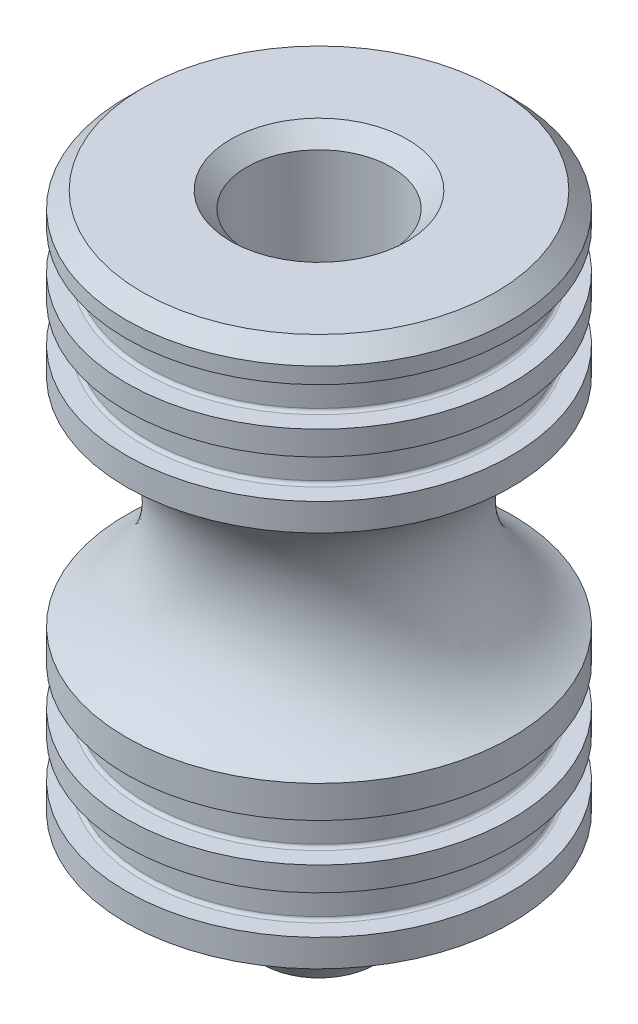
ISO-10303-21;
HEADER;
FILE_DESCRIPTION(('STEP AP214'),'2;1');
FILE_NAME('part.step','',(''),(''),'','','');
FILE_SCHEMA(('AUTOMOTIVE_DESIGN { 1 0 10303 214 1 1 1 1 }'));
ENDSEC;
DATA;
#1=APPLICATION_CONTEXT('core data for automotive mechanical design processes');
#2=APPLICATION_PROTOCOL_DEFINITION('international standard','automotive_design',2000,#1);
#3=PRODUCT_CONTEXT('',#1,'mechanical');
#4=PRODUCT('Part','Part','',(#3));
#5=PRODUCT_RELATED_PRODUCT_CATEGORY('part','',(#4));
#6=PRODUCT_DEFINITION_FORMATION('','',#4);
#7=PRODUCT_DEFINITION_CONTEXT('part definition',#1,'design');
#8=PRODUCT_DEFINITION('design','',#6,#7);
#9=PRODUCT_DEFINITION_SHAPE('','',#8);
#10=(LENGTH_UNIT() NAMED_UNIT(*) SI_UNIT(.MILLI.,.METRE.));
#11=(NAMED_UNIT(*) PLANE_ANGLE_UNIT() SI_UNIT($,.RADIAN.));
#12=(NAMED_UNIT(*) SI_UNIT($,.STERADIAN.) SOLID_ANGLE_UNIT());
#13=UNCERTAINTY_MEASURE_WITH_UNIT(LENGTH_MEASURE(1.E-05),#10,'distance_accuracy_value','');
#14=(GEOMETRIC_REPRESENTATION_CONTEXT(3) GLOBAL_UNCERTAINTY_ASSIGNED_CONTEXT((#13)) GLOBAL_UNIT_ASSIGNED_CONTEXT((#10,
#11,#12)) REPRESENTATION_CONTEXT('',''));
#15=CARTESIAN_POINT('',(0.,0.,0.));
#16=DIRECTION('',(0.,0.,1.));
#17=DIRECTION('',(1.,0.,0.));
#18=AXIS2_PLACEMENT_3D('',#15,#16,#17);
#19=CARTESIAN_POINT('',(0.,0.,0.));
#20=DIRECTION('',(0.,-1.,0.));
#21=DIRECTION('',(0.,0.,-1.));
#22=AXIS2_PLACEMENT_3D('',#19,#20,#21);
#23=PLANE('',#22);
#24=CARTESIAN_POINT('',(0.,0.,0.));
#25=DIRECTION('',(0.,-1.,0.));
#26=DIRECTION('',(0.,0.,-1.));
#27=AXIS2_PLACEMENT_3D('',#24,#25,#26);
#28=CIRCLE('',#27,3.5);
#29=CARTESIAN_POINT('',(0.,0.,-3.5));
#30=VERTEX_POINT('',#29);
#31=EDGE_CURVE('E188',#30,#30,#28,.T.);
#32=ORIENTED_EDGE('',*,*,#31,.T.);
#33=EDGE_LOOP('',(#32));
#34=FACE_BOUND('',#33,.T.);
#35=DIRECTION('',(-0.866025403784439,0.,-0.5));
#36=VECTOR('',#35,1.);
#37=CARTESIAN_POINT('',(1.,0.,-1.73205080756888));
#38=LINE('',#37,#36);
#39=CARTESIAN_POINT('',(2.,0.,-1.15470053837925));
#40=VERTEX_POINT('',#39);
#41=CARTESIAN_POINT('',(0.,0.,-2.3094010767585));
#42=VERTEX_POINT('',#41);
#43=EDGE_CURVE('E130',#40,#42,#38,.T.);
#44=ORIENTED_EDGE('',*,*,#43,.T.);
#45=DIRECTION('',(-0.866025403784439,0.,0.5));
#46=VECTOR('',#45,1.);
#47=CARTESIAN_POINT('',(-1.,0.,-1.73205080756888));
#48=LINE('',#47,#46);
#49=CARTESIAN_POINT('',(-2.,0.,-1.15470053837925));
#50=VERTEX_POINT('',#49);
#51=EDGE_CURVE('E58',#42,#50,#48,.T.);
#52=ORIENTED_EDGE('',*,*,#51,.T.);
#53=DIRECTION('',(0.,0.,1.));
#54=VECTOR('',#53,1.);
#55=CARTESIAN_POINT('',(-2.,0.,0.));
#56=LINE('',#55,#54);
#57=CARTESIAN_POINT('',(-2.,0.,1.15470053837925));
#58=VERTEX_POINT('',#57);
#59=EDGE_CURVE('E117',#50,#58,#56,.T.);
#60=ORIENTED_EDGE('',*,*,#59,.T.);
#61=DIRECTION('',(0.866025403784439,0.,0.5));
#62=VECTOR('',#61,1.);
#63=CARTESIAN_POINT('',(-1.,0.,1.73205080756888));
#64=LINE('',#63,#62);
#65=CARTESIAN_POINT('',(0.,0.,2.3094010767585));
#66=VERTEX_POINT('',#65);
#67=EDGE_CURVE('E120',#58,#66,#64,.T.);
#68=ORIENTED_EDGE('',*,*,#67,.T.);
#69=DIRECTION('',(0.866025403784439,0.,-0.5));
#70=VECTOR('',#69,1.);
#71=CARTESIAN_POINT('',(1.,0.,1.73205080756888));
#72=LINE('',#71,#70);
#73=CARTESIAN_POINT('',(2.,0.,1.15470053837925));
#74=VERTEX_POINT('',#73);
#75=EDGE_CURVE('E135',#66,#74,#72,.T.);
#76=ORIENTED_EDGE('',*,*,#75,.T.);
#77=DIRECTION('',(0.,0.,-1.));
#78=VECTOR('',#77,1.);
#79=CARTESIAN_POINT('',(2.,0.,0.));
#80=LINE('',#79,#78);
#81=EDGE_CURVE('E132',#74,#40,#80,.T.);
#82=ORIENTED_EDGE('',*,*,#81,.T.);
#83=EDGE_LOOP('',(#44,#52,#60,#68,#76,#82));
#84=FACE_BOUND('',#83,.T.);
#85=ADVANCED_FACE('F43',(#34,#84),#23,.T.);
#86=CARTESIAN_POINT('',(0.,0.,0.));
#87=DIRECTION('',(0.,-1.,0.));
#88=DIRECTION('',(0.,0.,-1.));
#89=AXIS2_PLACEMENT_3D('',#86,#87,#88);
#90=CYLINDRICAL_SURFACE('',#89,12.);
#91=CARTESIAN_POINT('',(0.,6.5,0.));
#92=DIRECTION('',(0.,-1.,0.));
#93=DIRECTION('',(0.,0.,-1.));
#94=AXIS2_PLACEMENT_3D('',#91,#92,#93);
#95=CIRCLE('',#94,12.);
#96=CARTESIAN_POINT('',(0.,6.5,-12.));
#97=VERTEX_POINT('',#96);
#98=EDGE_CURVE('E191',#97,#97,#95,.T.);
#99=ORIENTED_EDGE('',*,*,#98,.F.);
#100=EDGE_LOOP('',(#99));
#101=FACE_BOUND('',#100,.T.);
#102=CARTESIAN_POINT('',(0.,8.2,0.));
#103=DIRECTION('',(0.,-1.,0.));
#104=DIRECTION('',(0.,0.,-1.));
#105=AXIS2_PLACEMENT_3D('',#102,#103,#104);
#106=CIRCLE('',#105,12.);
#107=CARTESIAN_POINT('',(0.,8.2,-12.));
#108=VERTEX_POINT('',#107);
#109=EDGE_CURVE('E155',#108,#108,#106,.T.);
#110=ORIENTED_EDGE('',*,*,#109,.T.);
#111=EDGE_LOOP('',(#110));
#112=FACE_BOUND('',#111,.T.);
#113=ADVANCED_FACE('F301',(#101,#112),#90,.T.);
#114=CARTESIAN_POINT('',(0.,-7.53168300883464,0.));
#115=DIRECTION('',(0.,-1.,0.));
#116=DIRECTION('',(0.,0.,-1.));
#117=AXIS2_PLACEMENT_3D('',#114,#115,#116);
#118=TOROIDAL_SURFACE('',#117,15.9948164185206,14.5892661322666);
#119=ORIENTED_EDGE('',*,*,#31,.F.);
#120=EDGE_LOOP('',(#119));
#121=FACE_BOUND('',#120,.T.);
#122=ORIENTED_EDGE('',*,*,#98,.T.);
#123=EDGE_LOOP('',(#122));
#124=FACE_BOUND('',#123,.T.);
#125=ADVANCED_FACE('F307',(#121,#124),#118,.F.);
#126=CARTESIAN_POINT('',(0.,18.,0.));
#127=DIRECTION('',(0.,1.,0.));
#128=DIRECTION('',(0.,0.,1.));
#129=AXIS2_PLACEMENT_3D('',#126,#127,#128);
#130=PLANE('',#129);
#131=CARTESIAN_POINT('',(0.,18.,0.));
#132=DIRECTION('',(0.,1.,0.));
#133=DIRECTION('',(0.,0.,1.));
#134=AXIS2_PLACEMENT_3D('',#131,#132,#133);
#135=CIRCLE('',#134,3.5);
#136=CARTESIAN_POINT('',(0.,18.,3.5));
#137=VERTEX_POINT('',#136);
#138=EDGE_CURVE('E142',#137,#137,#135,.T.);
#139=ORIENTED_EDGE('',*,*,#138,.F.);
#140=EDGE_LOOP('',(#139));
#141=FACE_BOUND('',#140,.T.);
#142=CARTESIAN_POINT('',(0.,18.,0.));
#143=DIRECTION('',(0.,-1.,0.));
#144=DIRECTION('',(0.,0.,-1.));
#145=AXIS2_PLACEMENT_3D('',#142,#143,#144);
#146=CIRCLE('',#145,4.5);
#147=CARTESIAN_POINT('',(0.,18.,-4.5));
#148=VERTEX_POINT('',#147);
#149=EDGE_CURVE('E185',#148,#148,#146,.T.);
#150=ORIENTED_EDGE('',*,*,#149,.F.);
#151=EDGE_LOOP('',(#150));
#152=FACE_BOUND('',#151,.T.);
#153=ADVANCED_FACE('F315',(#141,#152),#130,.T.);
#154=CARTESIAN_POINT('',(0.,0.,0.));
#155=DIRECTION('',(0.,-1.,0.));
#156=DIRECTION('',(0.,0.,-1.));
#157=AXIS2_PLACEMENT_3D('',#154,#155,#156);
#158=CYLINDRICAL_SURFACE('',#157,4.5);
#159=CARTESIAN_POINT('',(0.,39.,0.));
#160=DIRECTION('',(0.,1.,0.));
#161=DIRECTION('',(0.,0.,1.));
#162=AXIS2_PLACEMENT_3D('',#159,#160,#161);
#163=CIRCLE('',#162,4.5);
#164=CARTESIAN_POINT('',(0.,39.,4.5));
#165=VERTEX_POINT('',#164);
#166=EDGE_CURVE('E203',#165,#165,#163,.T.);
#167=ORIENTED_EDGE('',*,*,#166,.T.);
#168=EDGE_LOOP('',(#167));
#169=FACE_BOUND('',#168,.T.);
#170=ORIENTED_EDGE('',*,*,#149,.T.);
#171=EDGE_LOOP('',(#170));
#172=FACE_BOUND('',#171,.T.);
#173=ADVANCED_FACE('F378',(#169,#172),#158,.F.);
#174=CARTESIAN_POINT('',(0.,40.,0.));
#175=DIRECTION('',(0.,1.,0.));
#176=DIRECTION('',(0.,0.,1.));
#177=AXIS2_PLACEMENT_3D('',#174,#175,#176);
#178=PLANE('',#177);
#179=CARTESIAN_POINT('',(0.,40.,0.));
#180=DIRECTION('',(0.,1.,0.));
#181=DIRECTION('',(0.,0.,1.));
#182=AXIS2_PLACEMENT_3D('',#179,#180,#181);
#183=CIRCLE('',#182,11.);
#184=CARTESIAN_POINT('',(0.,40.,11.));
#185=VERTEX_POINT('',#184);
#186=EDGE_CURVE('E200',#185,#185,#183,.T.);
#187=ORIENTED_EDGE('',*,*,#186,.T.);
#188=EDGE_LOOP('',(#187));
#189=FACE_BOUND('',#188,.T.);
#190=CARTESIAN_POINT('',(0.,40.,0.));
#191=DIRECTION('',(0.,1.,0.));
#192=DIRECTION('',(0.,0.,1.));
#193=AXIS2_PLACEMENT_3D('',#190,#191,#192);
#194=CIRCLE('',#193,5.50000000000001);
#195=CARTESIAN_POINT('',(0.,40.,5.50000000000001));
#196=VERTEX_POINT('',#195);
#197=EDGE_CURVE('E197',#196,#196,#194,.F.);
#198=ORIENTED_EDGE('',*,*,#197,.T.);
#199=EDGE_LOOP('',(#198));
#200=FACE_BOUND('',#199,.T.);
#201=ADVANCED_FACE('F298',(#189,#200),#178,.T.);
#202=CARTESIAN_POINT('',(0.,0.,0.));
#203=DIRECTION('',(0.,-1.,0.));
#204=DIRECTION('',(0.,0.,-1.));
#205=AXIS2_PLACEMENT_3D('',#202,#203,#204);
#206=CYLINDRICAL_SURFACE('',#205,12.);
#207=CARTESIAN_POINT('',(0.,39.,0.));
#208=DIRECTION('',(0.,1.,0.));
#209=DIRECTION('',(0.,0.,1.));
#210=AXIS2_PLACEMENT_3D('',#207,#208,#209);
#211=CIRCLE('',#210,12.);
#212=CARTESIAN_POINT('',(0.,39.,12.));
#213=VERTEX_POINT('',#212);
#214=EDGE_CURVE('E194',#213,#213,#211,.F.);
#215=ORIENTED_EDGE('',*,*,#214,.T.);
#216=EDGE_LOOP('',(#215));
#217=FACE_BOUND('',#216,.T.);
#218=CARTESIAN_POINT('',(0.,38.,0.));
#219=DIRECTION('',(0.,-1.,0.));
#220=DIRECTION('',(0.,0.,-1.));
#221=AXIS2_PLACEMENT_3D('',#218,#219,#220);
#222=CIRCLE('',#221,12.);
#223=CARTESIAN_POINT('',(0.,38.,-12.));
#224=VERTEX_POINT('',#223);
#225=EDGE_CURVE('E182',#224,#224,#222,.T.);
#226=ORIENTED_EDGE('',*,*,#225,.F.);
#227=EDGE_LOOP('',(#226));
#228=FACE_BOUND('',#227,.T.);
#229=ADVANCED_FACE('F281',(#217,#228),#206,.T.);
#230=CARTESIAN_POINT('',(0.,38.,0.));
#231=DIRECTION('',(0.,1.,0.));
#232=DIRECTION('',(0.,0.,1.));
#233=AXIS2_PLACEMENT_3D('',#230,#231,#232);
#234=PLANE('',#233);
#235=CARTESIAN_POINT('',(0.,38.,0.));
#236=DIRECTION('',(0.,1.,0.));
#237=DIRECTION('',(0.,0.,1.));
#238=AXIS2_PLACEMENT_3D('',#235,#236,#237);
#239=CIRCLE('',#238,10.9);
#240=CARTESIAN_POINT('',(0.,38.,10.9));
#241=VERTEX_POINT('',#240);
#242=EDGE_CURVE('E51',#241,#241,#239,.T.);
#243=ORIENTED_EDGE('',*,*,#242,.T.);
#244=EDGE_LOOP('',(#243));
#245=FACE_BOUND('',#244,.T.);
#246=ORIENTED_EDGE('',*,*,#225,.T.);
#247=EDGE_LOOP('',(#246));
#248=FACE_BOUND('',#247,.T.);
#249=ADVANCED_FACE('F250',(#245,#248),#234,.F.);
#250=CARTESIAN_POINT('',(0.,0.,0.));
#251=DIRECTION('',(0.,-1.,0.));
#252=DIRECTION('',(0.,0.,-1.));
#253=AXIS2_PLACEMENT_3D('',#250,#251,#252);
#254=CYLINDRICAL_SURFACE('',#253,10.7);
#255=CARTESIAN_POINT('',(0.,37.8,0.));
#256=DIRECTION('',(0.,1.,0.));
#257=DIRECTION('',(0.,0.,1.));
#258=AXIS2_PLACEMENT_3D('',#255,#256,#257);
#259=CIRCLE('',#258,10.7);
#260=CARTESIAN_POINT('',(0.,37.8,10.7));
#261=VERTEX_POINT('',#260);
#262=EDGE_CURVE('E245',#261,#261,#259,.F.);
#263=ORIENTED_EDGE('',*,*,#262,.T.);
#264=EDGE_LOOP('',(#263));
#265=FACE_BOUND('',#264,.T.);
#266=CARTESIAN_POINT('',(0.,35.8,0.));
#267=DIRECTION('',(0.,-1.,0.));
#268=DIRECTION('',(0.,0.,-1.));
#269=AXIS2_PLACEMENT_3D('',#266,#267,#268);
#270=CIRCLE('',#269,10.7);
#271=CARTESIAN_POINT('',(0.,35.8,-10.7));
#272=VERTEX_POINT('',#271);
#273=EDGE_CURVE('E242',#272,#272,#270,.F.);
#274=ORIENTED_EDGE('',*,*,#273,.T.);
#275=EDGE_LOOP('',(#274));
#276=FACE_BOUND('',#275,.T.);
#277=ADVANCED_FACE('F259',(#265,#276),#254,.T.);
#278=CARTESIAN_POINT('',(0.,35.6,0.));
#279=DIRECTION('',(0.,-1.,0.));
#280=DIRECTION('',(0.,0.,-1.));
#281=AXIS2_PLACEMENT_3D('',#278,#279,#280);
#282=PLANE('',#281);
#283=CARTESIAN_POINT('',(0.,35.6,0.));
#284=DIRECTION('',(0.,-1.,0.));
#285=DIRECTION('',(0.,0.,-1.));
#286=AXIS2_PLACEMENT_3D('',#283,#284,#285);
#287=CIRCLE('',#286,10.9);
#288=CARTESIAN_POINT('',(0.,35.6,-10.9));
#289=VERTEX_POINT('',#288);
#290=EDGE_CURVE('E11',#289,#289,#287,.T.);
#291=ORIENTED_EDGE('',*,*,#290,.T.);
#292=EDGE_LOOP('',(#291));
#293=FACE_BOUND('',#292,.T.);
#294=CARTESIAN_POINT('',(0.,35.6,0.));
#295=DIRECTION('',(0.,-1.,0.));
#296=DIRECTION('',(0.,0.,-1.));
#297=AXIS2_PLACEMENT_3D('',#294,#295,#296);
#298=CIRCLE('',#297,12.);
#299=CARTESIAN_POINT('',(0.,35.6,-12.));
#300=VERTEX_POINT('',#299);
#301=EDGE_CURVE('E179',#300,#300,#298,.T.);
#302=ORIENTED_EDGE('',*,*,#301,.F.);
#303=EDGE_LOOP('',(#302));
#304=FACE_BOUND('',#303,.T.);
#305=ADVANCED_FACE('F262',(#293,#304),#282,.F.);
#306=CARTESIAN_POINT('',(0.,34.1,0.));
#307=DIRECTION('',(0.,-1.,0.));
#308=DIRECTION('',(0.,0.,-1.));
#309=AXIS2_PLACEMENT_3D('',#306,#307,#308);
#310=CIRCLE('',#309,12.);
#311=CARTESIAN_POINT('',(0.,34.1,-12.));
#312=VERTEX_POINT('',#311);
#313=EDGE_CURVE('E176',#312,#312,#310,.T.);
#314=ORIENTED_EDGE('',*,*,#313,.F.);
#315=EDGE_LOOP('',(#314));
#316=FACE_BOUND('',#315,.T.);
#317=ORIENTED_EDGE('',*,*,#301,.T.);
#318=EDGE_LOOP('',(#317));
#319=FACE_BOUND('',#318,.T.);
#320=ADVANCED_FACE('F272',(#316,#319),#206,.T.);
#321=CARTESIAN_POINT('',(0.,34.1,0.));
#322=DIRECTION('',(0.,1.,0.));
#323=DIRECTION('',(0.,0.,1.));
#324=AXIS2_PLACEMENT_3D('',#321,#322,#323);
#325=PLANE('',#324);
#326=CARTESIAN_POINT('',(0.,34.1,0.));
#327=DIRECTION('',(0.,1.,0.));
#328=DIRECTION('',(0.,0.,1.));
#329=AXIS2_PLACEMENT_3D('',#326,#327,#328);
#330=CIRCLE('',#329,10.9);
#331=CARTESIAN_POINT('',(0.,34.1,10.9));
#332=VERTEX_POINT('',#331);
#333=EDGE_CURVE('E236',#332,#332,#330,.T.);
#334=ORIENTED_EDGE('',*,*,#333,.T.);
#335=EDGE_LOOP('',(#334));
#336=FACE_BOUND('',#335,.T.);
#337=ORIENTED_EDGE('',*,*,#313,.T.);
#338=EDGE_LOOP('',(#337));
#339=FACE_BOUND('',#338,.T.);
#340=ADVANCED_FACE('F277',(#336,#339),#325,.F.);
#341=CARTESIAN_POINT('',(0.,0.,0.));
#342=DIRECTION('',(0.,-1.,0.));
#343=DIRECTION('',(0.,0.,-1.));
#344=AXIS2_PLACEMENT_3D('',#341,#342,#343);
#345=CYLINDRICAL_SURFACE('',#344,10.7);
#346=CARTESIAN_POINT('',(0.,33.9,0.));
#347=DIRECTION('',(0.,1.,0.));
#348=DIRECTION('',(0.,0.,1.));
#349=AXIS2_PLACEMENT_3D('',#346,#347,#348);
#350=CIRCLE('',#349,10.7);
#351=CARTESIAN_POINT('',(0.,33.9,10.7));
#352=VERTEX_POINT('',#351);
#353=EDGE_CURVE('E233',#352,#352,#350,.F.);
#354=ORIENTED_EDGE('',*,*,#353,.T.);
#355=EDGE_LOOP('',(#354));
#356=FACE_BOUND('',#355,.T.);
#357=CARTESIAN_POINT('',(0.,31.9,0.));
#358=DIRECTION('',(0.,-1.,0.));
#359=DIRECTION('',(0.,0.,-1.));
#360=AXIS2_PLACEMENT_3D('',#357,#358,#359);
#361=CIRCLE('',#360,10.7);
#362=CARTESIAN_POINT('',(0.,31.9,-10.7));
#363=VERTEX_POINT('',#362);
#364=EDGE_CURVE('E230',#363,#363,#361,.F.);
#365=ORIENTED_EDGE('',*,*,#364,.T.);
#366=EDGE_LOOP('',(#365));
#367=FACE_BOUND('',#366,.T.);
#368=ADVANCED_FACE('F287',(#356,#367),#345,.T.);
#369=CARTESIAN_POINT('',(0.,31.7,0.));
#370=DIRECTION('',(0.,-1.,0.));
#371=DIRECTION('',(0.,0.,-1.));
#372=AXIS2_PLACEMENT_3D('',#369,#370,#371);
#373=PLANE('',#372);
#374=CARTESIAN_POINT('',(0.,31.7,0.));
#375=DIRECTION('',(0.,-1.,0.));
#376=DIRECTION('',(0.,0.,-1.));
#377=AXIS2_PLACEMENT_3D('',#374,#375,#376);
#378=CIRCLE('',#377,10.9);
#379=CARTESIAN_POINT('',(0.,31.7,-10.9));
#380=VERTEX_POINT('',#379);
#381=EDGE_CURVE('E239',#380,#380,#378,.T.);
#382=ORIENTED_EDGE('',*,*,#381,.T.);
#383=EDGE_LOOP('',(#382));
#384=FACE_BOUND('',#383,.T.);
#385=CARTESIAN_POINT('',(0.,31.7,0.));
#386=DIRECTION('',(0.,-1.,0.));
#387=DIRECTION('',(0.,0.,-1.));
#388=AXIS2_PLACEMENT_3D('',#385,#386,#387);
#389=CIRCLE('',#388,12.);
#390=CARTESIAN_POINT('',(0.,31.7,-12.));
#391=VERTEX_POINT('',#390);
#392=EDGE_CURVE('E173',#391,#391,#389,.T.);
#393=ORIENTED_EDGE('',*,*,#392,.F.);
#394=EDGE_LOOP('',(#393));
#395=FACE_BOUND('',#394,.T.);
#396=ADVANCED_FACE('F295',(#384,#395),#373,.F.);
#397=CARTESIAN_POINT('',(0.,30.,0.));
#398=DIRECTION('',(0.,-1.,0.));
#399=DIRECTION('',(0.,0.,-1.));
#400=AXIS2_PLACEMENT_3D('',#397,#398,#399);
#401=CIRCLE('',#400,12.);
#402=CARTESIAN_POINT('',(0.,30.,-12.));
#403=VERTEX_POINT('',#402);
#404=EDGE_CURVE('E170',#403,#403,#401,.T.);
#405=ORIENTED_EDGE('',*,*,#404,.F.);
#406=EDGE_LOOP('',(#405));
#407=FACE_BOUND('',#406,.T.);
#408=ORIENTED_EDGE('',*,*,#392,.T.);
#409=EDGE_LOOP('',(#408));
#410=FACE_BOUND('',#409,.T.);
#411=ADVANCED_FACE('F280',(#407,#410),#206,.T.);
#412=CARTESIAN_POINT('',(0.,23.25,0.));
#413=DIRECTION('',(0.,-1.,0.));
#414=DIRECTION('',(0.,0.,-1.));
#415=AXIS2_PLACEMENT_3D('',#412,#413,#414);
#416=TOROIDAL_SURFACE('',#415,15.2691742076555,7.5);
#417=ORIENTED_EDGE('',*,*,#404,.T.);
#418=EDGE_LOOP('',(#417));
#419=FACE_BOUND('',#418,.T.);
#420=CARTESIAN_POINT('',(0.,16.5,0.));
#421=DIRECTION('',(0.,-1.,0.));
#422=DIRECTION('',(0.,0.,-1.));
#423=AXIS2_PLACEMENT_3D('',#420,#421,#422);
#424=CIRCLE('',#423,12.);
#425=CARTESIAN_POINT('',(0.,16.5,-12.));
#426=VERTEX_POINT('',#425);
#427=EDGE_CURVE('E167',#426,#426,#424,.T.);
#428=ORIENTED_EDGE('',*,*,#427,.F.);
#429=EDGE_LOOP('',(#428));
#430=FACE_BOUND('',#429,.T.);
#431=ADVANCED_FACE('F294',(#419,#430),#416,.F.);
#432=CARTESIAN_POINT('',(0.,14.5,0.));
#433=DIRECTION('',(0.,-1.,0.));
#434=DIRECTION('',(0.,0.,-1.));
#435=AXIS2_PLACEMENT_3D('',#432,#433,#434);
#436=CIRCLE('',#435,12.);
#437=CARTESIAN_POINT('',(0.,14.5,-12.));
#438=VERTEX_POINT('',#437);
#439=EDGE_CURVE('E164',#438,#438,#436,.T.);
#440=ORIENTED_EDGE('',*,*,#439,.F.);
#441=EDGE_LOOP('',(#440));
#442=FACE_BOUND('',#441,.T.);
#443=ORIENTED_EDGE('',*,*,#427,.T.);
#444=EDGE_LOOP('',(#443));
#445=FACE_BOUND('',#444,.T.);
#446=ADVANCED_FACE('F310',(#442,#445),#90,.T.);
#447=CARTESIAN_POINT('',(0.,14.5,0.));
#448=DIRECTION('',(0.,1.,0.));
#449=DIRECTION('',(0.,0.,1.));
#450=AXIS2_PLACEMENT_3D('',#447,#448,#449);
#451=PLANE('',#450);
#452=CARTESIAN_POINT('',(0.,14.5,0.));
#453=DIRECTION('',(0.,1.,0.));
#454=DIRECTION('',(0.,0.,1.));
#455=AXIS2_PLACEMENT_3D('',#452,#453,#454);
#456=CIRCLE('',#455,10.9);
#457=CARTESIAN_POINT('',(0.,14.5,10.9));
#458=VERTEX_POINT('',#457);
#459=EDGE_CURVE('E212',#458,#458,#456,.T.);
#460=ORIENTED_EDGE('',*,*,#459,.T.);
#461=EDGE_LOOP('',(#460));
#462=FACE_BOUND('',#461,.T.);
#463=ORIENTED_EDGE('',*,*,#439,.T.);
#464=EDGE_LOOP('',(#463));
#465=FACE_BOUND('',#464,.T.);
#466=ADVANCED_FACE('F431',(#462,#465),#451,.F.);
#467=CARTESIAN_POINT('',(0.,0.,0.));
#468=DIRECTION('',(0.,-1.,0.));
#469=DIRECTION('',(0.,0.,-1.));
#470=AXIS2_PLACEMENT_3D('',#467,#468,#469);
#471=CYLINDRICAL_SURFACE('',#470,10.7);
#472=CARTESIAN_POINT('',(0.,14.3,0.));
#473=DIRECTION('',(0.,1.,0.));
#474=DIRECTION('',(0.,0.,1.));
#475=AXIS2_PLACEMENT_3D('',#472,#473,#474);
#476=CIRCLE('',#475,10.7);
#477=CARTESIAN_POINT('',(0.,14.3,10.7));
#478=VERTEX_POINT('',#477);
#479=EDGE_CURVE('E209',#478,#478,#476,.F.);
#480=ORIENTED_EDGE('',*,*,#479,.T.);
#481=EDGE_LOOP('',(#480));
#482=FACE_BOUND('',#481,.T.);
#483=CARTESIAN_POINT('',(0.,12.3,0.));
#484=DIRECTION('',(0.,-1.,0.));
#485=DIRECTION('',(0.,0.,-1.));
#486=AXIS2_PLACEMENT_3D('',#483,#484,#485);
#487=CIRCLE('',#486,10.7);
#488=CARTESIAN_POINT('',(0.,12.3,-10.7));
#489=VERTEX_POINT('',#488);
#490=EDGE_CURVE('E206',#489,#489,#487,.F.);
#491=ORIENTED_EDGE('',*,*,#490,.T.);
#492=EDGE_LOOP('',(#491));
#493=FACE_BOUND('',#492,.T.);
#494=ADVANCED_FACE('F427',(#482,#493),#471,.T.);
#495=CARTESIAN_POINT('',(0.,12.1,0.));
#496=DIRECTION('',(0.,-1.,0.));
#497=DIRECTION('',(0.,0.,-1.));
#498=AXIS2_PLACEMENT_3D('',#495,#496,#497);
#499=PLANE('',#498);
#500=CARTESIAN_POINT('',(0.,12.1,0.));
#501=DIRECTION('',(0.,-1.,0.));
#502=DIRECTION('',(0.,0.,-1.));
#503=AXIS2_PLACEMENT_3D('',#500,#501,#502);
#504=CIRCLE('',#503,10.9);
#505=CARTESIAN_POINT('',(0.,12.1,-10.9));
#506=VERTEX_POINT('',#505);
#507=EDGE_CURVE('E215',#506,#506,#504,.T.);
#508=ORIENTED_EDGE('',*,*,#507,.T.);
#509=EDGE_LOOP('',(#508));
#510=FACE_BOUND('',#509,.T.);
#511=CARTESIAN_POINT('',(0.,12.1,0.));
#512=DIRECTION('',(0.,-1.,0.));
#513=DIRECTION('',(0.,0.,-1.));
#514=AXIS2_PLACEMENT_3D('',#511,#512,#513);
#515=CIRCLE('',#514,12.);
#516=CARTESIAN_POINT('',(0.,12.1,-12.));
#517=VERTEX_POINT('',#516);
#518=EDGE_CURVE('E161',#517,#517,#515,.T.);
#519=ORIENTED_EDGE('',*,*,#518,.F.);
#520=EDGE_LOOP('',(#519));
#521=FACE_BOUND('',#520,.T.);
#522=ADVANCED_FACE('F423',(#510,#521),#499,.F.);
#523=CARTESIAN_POINT('',(0.,10.6,0.));
#524=DIRECTION('',(0.,-1.,0.));
#525=DIRECTION('',(0.,0.,-1.));
#526=AXIS2_PLACEMENT_3D('',#523,#524,#525);
#527=CIRCLE('',#526,12.);
#528=CARTESIAN_POINT('',(0.,10.6,-12.));
#529=VERTEX_POINT('',#528);
#530=EDGE_CURVE('E158',#529,#529,#527,.T.);
#531=ORIENTED_EDGE('',*,*,#530,.F.);
#532=EDGE_LOOP('',(#531));
#533=FACE_BOUND('',#532,.T.);
#534=ORIENTED_EDGE('',*,*,#518,.T.);
#535=EDGE_LOOP('',(#534));
#536=FACE_BOUND('',#535,.T.);
#537=ADVANCED_FACE('F311',(#533,#536),#90,.T.);
#538=CARTESIAN_POINT('',(0.,10.6,0.));
#539=DIRECTION('',(0.,1.,0.));
#540=DIRECTION('',(0.,0.,1.));
#541=AXIS2_PLACEMENT_3D('',#538,#539,#540);
#542=PLANE('',#541);
#543=CARTESIAN_POINT('',(0.,10.6,0.));
#544=DIRECTION('',(0.,1.,0.));
#545=DIRECTION('',(0.,0.,1.));
#546=AXIS2_PLACEMENT_3D('',#543,#544,#545);
#547=CIRCLE('',#546,10.9);
#548=CARTESIAN_POINT('',(0.,10.6,10.9));
#549=VERTEX_POINT('',#548);
#550=EDGE_CURVE('E224',#549,#549,#547,.T.);
#551=ORIENTED_EDGE('',*,*,#550,.T.);
#552=EDGE_LOOP('',(#551));
#553=FACE_BOUND('',#552,.T.);
#554=ORIENTED_EDGE('',*,*,#530,.T.);
#555=EDGE_LOOP('',(#554));
#556=FACE_BOUND('',#555,.T.);
#557=ADVANCED_FACE('F417',(#553,#556),#542,.F.);
#558=CARTESIAN_POINT('',(0.,0.,0.));
#559=DIRECTION('',(0.,-1.,0.));
#560=DIRECTION('',(0.,0.,-1.));
#561=AXIS2_PLACEMENT_3D('',#558,#559,#560);
#562=CYLINDRICAL_SURFACE('',#561,10.7);
#563=CARTESIAN_POINT('',(0.,10.4,0.));
#564=DIRECTION('',(0.,1.,0.));
#565=DIRECTION('',(0.,0.,1.));
#566=AXIS2_PLACEMENT_3D('',#563,#564,#565);
#567=CIRCLE('',#566,10.7);
#568=CARTESIAN_POINT('',(0.,10.4,10.7));
#569=VERTEX_POINT('',#568);
#570=EDGE_CURVE('E221',#569,#569,#567,.F.);
#571=ORIENTED_EDGE('',*,*,#570,.T.);
#572=EDGE_LOOP('',(#571));
#573=FACE_BOUND('',#572,.T.);
#574=CARTESIAN_POINT('',(0.,8.4,0.));
#575=DIRECTION('',(0.,-1.,0.));
#576=DIRECTION('',(0.,0.,-1.));
#577=AXIS2_PLACEMENT_3D('',#574,#575,#576);
#578=CIRCLE('',#577,10.7);
#579=CARTESIAN_POINT('',(0.,8.4,-10.7));
#580=VERTEX_POINT('',#579);
#581=EDGE_CURVE('E218',#580,#580,#578,.F.);
#582=ORIENTED_EDGE('',*,*,#581,.T.);
#583=EDGE_LOOP('',(#582));
#584=FACE_BOUND('',#583,.T.);
#585=ADVANCED_FACE('F413',(#573,#584),#562,.T.);
#586=CARTESIAN_POINT('',(0.,8.2,0.));
#587=DIRECTION('',(0.,-1.,0.));
#588=DIRECTION('',(0.,0.,-1.));
#589=AXIS2_PLACEMENT_3D('',#586,#587,#588);
#590=PLANE('',#589);
#591=CARTESIAN_POINT('',(0.,8.2,0.));
#592=DIRECTION('',(0.,-1.,0.));
#593=DIRECTION('',(0.,0.,-1.));
#594=AXIS2_PLACEMENT_3D('',#591,#592,#593);
#595=CIRCLE('',#594,10.9);
#596=CARTESIAN_POINT('',(0.,8.2,-10.9));
#597=VERTEX_POINT('',#596);
#598=EDGE_CURVE('E227',#597,#597,#595,.T.);
#599=ORIENTED_EDGE('',*,*,#598,.T.);
#600=EDGE_LOOP('',(#599));
#601=FACE_BOUND('',#600,.T.);
#602=ORIENTED_EDGE('',*,*,#109,.F.);
#603=EDGE_LOOP('',(#602));
#604=FACE_BOUND('',#603,.T.);
#605=ADVANCED_FACE('F328',(#601,#604),#590,.F.);
#606=CARTESIAN_POINT('',(0.,39.,0.));
#607=DIRECTION('',(0.,-1.,0.));
#608=DIRECTION('',(0.,0.,-1.));
#609=AXIS2_PLACEMENT_3D('',#606,#607,#608);
#610=CONICAL_SURFACE('',#609,12.,0.785398163397452);
#611=ORIENTED_EDGE('',*,*,#186,.F.);
#612=EDGE_LOOP('',(#611));
#613=FACE_BOUND('',#612,.T.);
#614=ORIENTED_EDGE('',*,*,#214,.F.);
#615=EDGE_LOOP('',(#614));
#616=FACE_BOUND('',#615,.T.);
#617=ADVANCED_FACE('F321',(#613,#616),#610,.T.);
#618=CARTESIAN_POINT('',(0.,40.,0.));
#619=DIRECTION('',(0.,1.,0.));
#620=DIRECTION('',(0.,0.,1.));
#621=AXIS2_PLACEMENT_3D('',#618,#619,#620);
#622=CONICAL_SURFACE('',#621,5.50000000000001,0.785398163397447);
#623=ORIENTED_EDGE('',*,*,#166,.F.);
#624=EDGE_LOOP('',(#623));
#625=FACE_BOUND('',#624,.T.);
#626=ORIENTED_EDGE('',*,*,#197,.F.);
#627=EDGE_LOOP('',(#626));
#628=FACE_BOUND('',#627,.T.);
#629=ADVANCED_FACE('F327',(#625,#628),#622,.F.);
#630=CARTESIAN_POINT('',(0.,11.1030121665965,0.));
#631=DIRECTION('',(0.,1.,0.));
#632=DIRECTION('',(0.,0.,1.));
#633=AXIS2_PLACEMENT_3D('',#630,#631,#632);
#634=CONICAL_SURFACE('',#633,3.5,1.02974425867665);
#635=CARTESIAN_POINT('',(0.,9.,0.));
#636=VERTEX_POINT('',#635);
#637=VERTEX_LOOP('',#636);
#638=FACE_BOUND('',#637,.T.);
#639=CARTESIAN_POINT('',(0.,11.1030121665965,0.));
#640=DIRECTION('',(0.,1.,0.));
#641=DIRECTION('',(0.,0.,1.));
#642=AXIS2_PLACEMENT_3D('',#639,#640,#641);
#643=CIRCLE('',#642,3.5);
#644=CARTESIAN_POINT('',(0.,11.1030121665965,3.5));
#645=VERTEX_POINT('',#644);
#646=EDGE_CURVE('E152',#645,#645,#643,.T.);
#647=ORIENTED_EDGE('',*,*,#646,.T.);
#648=EDGE_LOOP('',(#647));
#649=FACE_BOUND('',#648,.T.);
#650=ADVANCED_FACE('F334',(#638,#649),#634,.F.);
#651=CARTESIAN_POINT('',(0.,18.,0.));
#652=DIRECTION('',(0.,1.,0.));
#653=DIRECTION('',(0.,0.,1.));
#654=AXIS2_PLACEMENT_3D('',#651,#652,#653);
#655=CYLINDRICAL_SURFACE('',#654,3.5);
#656=ORIENTED_EDGE('',*,*,#646,.F.);
#657=EDGE_LOOP('',(#656));
#658=FACE_BOUND('',#657,.T.);
#659=ORIENTED_EDGE('',*,*,#138,.T.);
#660=EDGE_LOOP('',(#659));
#661=FACE_BOUND('',#660,.T.);
#662=ADVANCED_FACE('F397',(#658,#661),#655,.F.);
#663=CARTESIAN_POINT('',(-1.,3.,-1.73205080756888));
#664=DIRECTION('',(0.5,0.,0.866025403784439));
#665=DIRECTION('',(0.866025403784439,0.,-0.5));
#666=AXIS2_PLACEMENT_3D('',#663,#664,#665);
#667=PLANE('',#666);
#668=ORIENTED_EDGE('',*,*,#51,.F.);
#669=DIRECTION('',(0.,-1.,0.));
#670=VECTOR('',#669,1.);
#671=CARTESIAN_POINT('',(0.,3.,-2.3094010767585));
#672=LINE('',#671,#670);
#673=CARTESIAN_POINT('',(0.,3.,-2.3094010767585));
#674=VERTEX_POINT('',#673);
#675=EDGE_CURVE('E101',#674,#42,#672,.T.);
#676=ORIENTED_EDGE('',*,*,#675,.F.);
#677=DIRECTION('',(-0.866025403784439,0.,0.5));
#678=VECTOR('',#677,1.);
#679=CARTESIAN_POINT('',(-1.,3.,-1.73205080756888));
#680=LINE('',#679,#678);
#681=CARTESIAN_POINT('',(-2.,3.,-1.15470053837925));
#682=VERTEX_POINT('',#681);
#683=EDGE_CURVE('E108',#674,#682,#680,.T.);
#684=ORIENTED_EDGE('',*,*,#683,.T.);
#685=DIRECTION('',(0.,-1.,0.));
#686=VECTOR('',#685,1.);
#687=CARTESIAN_POINT('',(-2.,3.,-1.15470053837925));
#688=LINE('',#687,#686);
#689=EDGE_CURVE('E140',#682,#50,#688,.T.);
#690=ORIENTED_EDGE('',*,*,#689,.T.);
#691=EDGE_LOOP('',(#668,#676,#684,#690));
#692=FACE_BOUND('',#691,.T.);
#693=ADVANCED_FACE('F111',(#692),#667,.T.);
#694=CARTESIAN_POINT('',(-2.,3.,0.));
#695=DIRECTION('',(1.,0.,0.));
#696=DIRECTION('',(0.,0.,-1.));
#697=AXIS2_PLACEMENT_3D('',#694,#695,#696);
#698=PLANE('',#697);
#699=ORIENTED_EDGE('',*,*,#59,.F.);
#700=ORIENTED_EDGE('',*,*,#689,.F.);
#701=DIRECTION('',(0.,0.,1.));
#702=VECTOR('',#701,1.);
#703=CARTESIAN_POINT('',(-2.,3.,0.));
#704=LINE('',#703,#702);
#705=CARTESIAN_POINT('',(-2.,3.,1.15470053837925));
#706=VERTEX_POINT('',#705);
#707=EDGE_CURVE('E113',#682,#706,#704,.T.);
#708=ORIENTED_EDGE('',*,*,#707,.T.);
#709=DIRECTION('',(0.,-1.,0.));
#710=VECTOR('',#709,1.);
#711=CARTESIAN_POINT('',(-2.,3.,1.15470053837925));
#712=LINE('',#711,#710);
#713=EDGE_CURVE('E143',#706,#58,#712,.T.);
#714=ORIENTED_EDGE('',*,*,#713,.T.);
#715=EDGE_LOOP('',(#699,#700,#708,#714));
#716=FACE_BOUND('',#715,.T.);
#717=ADVANCED_FACE('F405',(#716),#698,.T.);
#718=CARTESIAN_POINT('',(-1.,3.,1.73205080756888));
#719=DIRECTION('',(0.5,0.,-0.866025403784439));
#720=DIRECTION('',(-0.866025403784439,0.,-0.5));
#721=AXIS2_PLACEMENT_3D('',#718,#719,#720);
#722=PLANE('',#721);
#723=ORIENTED_EDGE('',*,*,#67,.F.);
#724=ORIENTED_EDGE('',*,*,#713,.F.);
#725=DIRECTION('',(0.866025403784439,0.,0.5));
#726=VECTOR('',#725,1.);
#727=CARTESIAN_POINT('',(-1.,3.,1.73205080756888));
#728=LINE('',#727,#726);
#729=CARTESIAN_POINT('',(0.,3.,2.3094010767585));
#730=VERTEX_POINT('',#729);
#731=EDGE_CURVE('E126',#706,#730,#728,.T.);
#732=ORIENTED_EDGE('',*,*,#731,.T.);
#733=DIRECTION('',(0.,-1.,0.));
#734=VECTOR('',#733,1.);
#735=CARTESIAN_POINT('',(0.,3.,2.3094010767585));
#736=LINE('',#735,#734);
#737=EDGE_CURVE('E145',#730,#66,#736,.T.);
#738=ORIENTED_EDGE('',*,*,#737,.T.);
#739=EDGE_LOOP('',(#723,#724,#732,#738));
#740=FACE_BOUND('',#739,.T.);
#741=ADVANCED_FACE('F532',(#740),#722,.T.);
#742=CARTESIAN_POINT('',(1.,3.,1.73205080756888));
#743=DIRECTION('',(-0.5,0.,-0.866025403784439));
#744=DIRECTION('',(-0.866025403784439,0.,0.5));
#745=AXIS2_PLACEMENT_3D('',#742,#743,#744);
#746=PLANE('',#745);
#747=ORIENTED_EDGE('',*,*,#75,.F.);
#748=ORIENTED_EDGE('',*,*,#737,.F.);
#749=DIRECTION('',(0.866025403784439,0.,-0.5));
#750=VECTOR('',#749,1.);
#751=CARTESIAN_POINT('',(1.,3.,1.73205080756888));
#752=LINE('',#751,#750);
#753=CARTESIAN_POINT('',(2.,3.,1.15470053837925));
#754=VERTEX_POINT('',#753);
#755=EDGE_CURVE('E124',#730,#754,#752,.T.);
#756=ORIENTED_EDGE('',*,*,#755,.T.);
#757=DIRECTION('',(0.,-1.,0.));
#758=VECTOR('',#757,1.);
#759=CARTESIAN_POINT('',(2.,3.,1.15470053837925));
#760=LINE('',#759,#758);
#761=EDGE_CURVE('E147',#754,#74,#760,.T.);
#762=ORIENTED_EDGE('',*,*,#761,.T.);
#763=EDGE_LOOP('',(#747,#748,#756,#762));
#764=FACE_BOUND('',#763,.T.);
#765=ADVANCED_FACE('F542',(#764),#746,.T.);
#766=CARTESIAN_POINT('',(2.,3.,0.));
#767=DIRECTION('',(-1.,0.,0.));
#768=DIRECTION('',(0.,0.,1.));
#769=AXIS2_PLACEMENT_3D('',#766,#767,#768);
#770=PLANE('',#769);
#771=ORIENTED_EDGE('',*,*,#81,.F.);
#772=ORIENTED_EDGE('',*,*,#761,.F.);
#773=DIRECTION('',(0.,0.,-1.));
#774=VECTOR('',#773,1.);
#775=CARTESIAN_POINT('',(2.,3.,0.));
#776=LINE('',#775,#774);
#777=CARTESIAN_POINT('',(2.,3.,-1.15470053837925));
#778=VERTEX_POINT('',#777);
#779=EDGE_CURVE('E107',#754,#778,#776,.T.);
#780=ORIENTED_EDGE('',*,*,#779,.T.);
#781=DIRECTION('',(0.,-1.,0.));
#782=VECTOR('',#781,1.);
#783=CARTESIAN_POINT('',(2.,3.,-1.15470053837925));
#784=LINE('',#783,#782);
#785=EDGE_CURVE('E103',#778,#40,#784,.T.);
#786=ORIENTED_EDGE('',*,*,#785,.T.);
#787=EDGE_LOOP('',(#771,#772,#780,#786));
#788=FACE_BOUND('',#787,.T.);
#789=ADVANCED_FACE('F552',(#788),#770,.T.);
#790=CARTESIAN_POINT('',(1.,3.,-1.73205080756888));
#791=DIRECTION('',(-0.5,0.,0.866025403784439));
#792=DIRECTION('',(0.866025403784439,0.,0.5));
#793=AXIS2_PLACEMENT_3D('',#790,#791,#792);
#794=PLANE('',#793);
#795=ORIENTED_EDGE('',*,*,#43,.F.);
#796=ORIENTED_EDGE('',*,*,#785,.F.);
#797=DIRECTION('',(-0.866025403784439,0.,-0.5));
#798=VECTOR('',#797,1.);
#799=CARTESIAN_POINT('',(1.,3.,-1.73205080756888));
#800=LINE('',#799,#798);
#801=EDGE_CURVE('E98',#778,#674,#800,.T.);
#802=ORIENTED_EDGE('',*,*,#801,.T.);
#803=ORIENTED_EDGE('',*,*,#675,.T.);
#804=EDGE_LOOP('',(#795,#796,#802,#803));
#805=FACE_BOUND('',#804,.T.);
#806=ADVANCED_FACE('F100',(#805),#794,.T.);
#807=CARTESIAN_POINT('',(0.,3.,0.));
#808=DIRECTION('',(0.,-1.,0.));
#809=DIRECTION('',(0.,0.,-1.));
#810=AXIS2_PLACEMENT_3D('',#807,#808,#809);
#811=PLANE('',#810);
#812=ORIENTED_EDGE('',*,*,#683,.F.);
#813=ORIENTED_EDGE('',*,*,#801,.F.);
#814=ORIENTED_EDGE('',*,*,#779,.F.);
#815=ORIENTED_EDGE('',*,*,#755,.F.);
#816=ORIENTED_EDGE('',*,*,#731,.F.);
#817=ORIENTED_EDGE('',*,*,#707,.F.);
#818=EDGE_LOOP('',(#812,#813,#814,#815,#816,#817));
#819=FACE_BOUND('',#818,.T.);
#820=ADVANCED_FACE('F115',(#819),#811,.T.);
#821=CARTESIAN_POINT('',(0.,14.3,0.));
#822=DIRECTION('',(0.,1.,0.));
#823=DIRECTION('',(0.,0.,1.));
#824=AXIS2_PLACEMENT_3D('',#821,#822,#823);
#825=TOROIDAL_SURFACE('',#824,10.9,0.2);
#826=ORIENTED_EDGE('',*,*,#459,.F.);
#827=EDGE_LOOP('',(#826));
#828=FACE_BOUND('',#827,.T.);
#829=ORIENTED_EDGE('',*,*,#479,.F.);
#830=EDGE_LOOP('',(#829));
#831=FACE_BOUND('',#830,.T.);
#832=ADVANCED_FACE('F336',(#828,#831),#825,.F.);
#833=CARTESIAN_POINT('',(0.,12.3,0.));
#834=DIRECTION('',(0.,-1.,0.));
#835=DIRECTION('',(0.,0.,-1.));
#836=AXIS2_PLACEMENT_3D('',#833,#834,#835);
#837=TOROIDAL_SURFACE('',#836,10.9,0.2);
#838=ORIENTED_EDGE('',*,*,#490,.F.);
#839=EDGE_LOOP('',(#838));
#840=FACE_BOUND('',#839,.T.);
#841=ORIENTED_EDGE('',*,*,#507,.F.);
#842=EDGE_LOOP('',(#841));
#843=FACE_BOUND('',#842,.T.);
#844=ADVANCED_FACE('F339',(#840,#843),#837,.F.);
#845=CARTESIAN_POINT('',(0.,10.4,0.));
#846=DIRECTION('',(0.,1.,0.));
#847=DIRECTION('',(0.,0.,1.));
#848=AXIS2_PLACEMENT_3D('',#845,#846,#847);
#849=TOROIDAL_SURFACE('',#848,10.9,0.2);
#850=ORIENTED_EDGE('',*,*,#550,.F.);
#851=EDGE_LOOP('',(#850));
#852=FACE_BOUND('',#851,.T.);
#853=ORIENTED_EDGE('',*,*,#570,.F.);
#854=EDGE_LOOP('',(#853));
#855=FACE_BOUND('',#854,.T.);
#856=ADVANCED_FACE('F343',(#852,#855),#849,.F.);
#857=CARTESIAN_POINT('',(0.,8.4,0.));
#858=DIRECTION('',(0.,-1.,0.));
#859=DIRECTION('',(0.,0.,-1.));
#860=AXIS2_PLACEMENT_3D('',#857,#858,#859);
#861=TOROIDAL_SURFACE('',#860,10.9,0.2);
#862=ORIENTED_EDGE('',*,*,#581,.F.);
#863=EDGE_LOOP('',(#862));
#864=FACE_BOUND('',#863,.T.);
#865=ORIENTED_EDGE('',*,*,#598,.F.);
#866=EDGE_LOOP('',(#865));
#867=FACE_BOUND('',#866,.T.);
#868=ADVANCED_FACE('F347',(#864,#867),#861,.F.);
#869=CARTESIAN_POINT('',(0.,33.9,0.));
#870=DIRECTION('',(0.,1.,0.));
#871=DIRECTION('',(0.,0.,1.));
#872=AXIS2_PLACEMENT_3D('',#869,#870,#871);
#873=TOROIDAL_SURFACE('',#872,10.9,0.2);
#874=ORIENTED_EDGE('',*,*,#333,.F.);
#875=EDGE_LOOP('',(#874));
#876=FACE_BOUND('',#875,.T.);
#877=ORIENTED_EDGE('',*,*,#353,.F.);
#878=EDGE_LOOP('',(#877));
#879=FACE_BOUND('',#878,.T.);
#880=ADVANCED_FACE('F351',(#876,#879),#873,.F.);
#881=CARTESIAN_POINT('',(0.,31.9,0.));
#882=DIRECTION('',(0.,-1.,0.));
#883=DIRECTION('',(0.,0.,-1.));
#884=AXIS2_PLACEMENT_3D('',#881,#882,#883);
#885=TOROIDAL_SURFACE('',#884,10.9,0.2);
#886=ORIENTED_EDGE('',*,*,#364,.F.);
#887=EDGE_LOOP('',(#886));
#888=FACE_BOUND('',#887,.T.);
#889=ORIENTED_EDGE('',*,*,#381,.F.);
#890=EDGE_LOOP('',(#889));
#891=FACE_BOUND('',#890,.T.);
#892=ADVANCED_FACE('F256',(#888,#891),#885,.F.);
#893=CARTESIAN_POINT('',(0.,37.8,0.));
#894=DIRECTION('',(0.,1.,0.));
#895=DIRECTION('',(0.,0.,1.));
#896=AXIS2_PLACEMENT_3D('',#893,#894,#895);
#897=TOROIDAL_SURFACE('',#896,10.9,0.2);
#898=ORIENTED_EDGE('',*,*,#242,.F.);
#899=EDGE_LOOP('',(#898));
#900=FACE_BOUND('',#899,.T.);
#901=ORIENTED_EDGE('',*,*,#262,.F.);
#902=EDGE_LOOP('',(#901));
#903=FACE_BOUND('',#902,.T.);
#904=ADVANCED_FACE('F253',(#900,#903),#897,.F.);
#905=CARTESIAN_POINT('',(0.,35.8,0.));
#906=DIRECTION('',(0.,-1.,0.));
#907=DIRECTION('',(0.,0.,-1.));
#908=AXIS2_PLACEMENT_3D('',#905,#906,#907);
#909=TOROIDAL_SURFACE('',#908,10.9,0.2);
#910=ORIENTED_EDGE('',*,*,#273,.F.);
#911=EDGE_LOOP('',(#910));
#912=FACE_BOUND('',#911,.T.);
#913=ORIENTED_EDGE('',*,*,#290,.F.);
#914=EDGE_LOOP('',(#913));
#915=FACE_BOUND('',#914,.T.);
#916=ADVANCED_FACE('F45',(#912,#915),#909,.F.);
#917=CLOSED_SHELL('',(#85,#113,#125,#153,#173,#201,#229,#249,#277,#305,#320,#340,#368,#396,#411,
#431,#446,#466,#494,#522,#537,#557,#585,#605,#617,#629,#650,#662,#693,#717,#741,#765,#789,#806,
#820,#832,#844,#856,#868,#880,#892,#904,#916));
#918=MANIFOLD_SOLID_BREP('B2',#917);
#919=ADVANCED_BREP_SHAPE_REPRESENTATION('',(#18,#918),#14);
#920=SHAPE_DEFINITION_REPRESENTATION(#9,#919);
ENDSEC;
END-ISO-10303-21;
